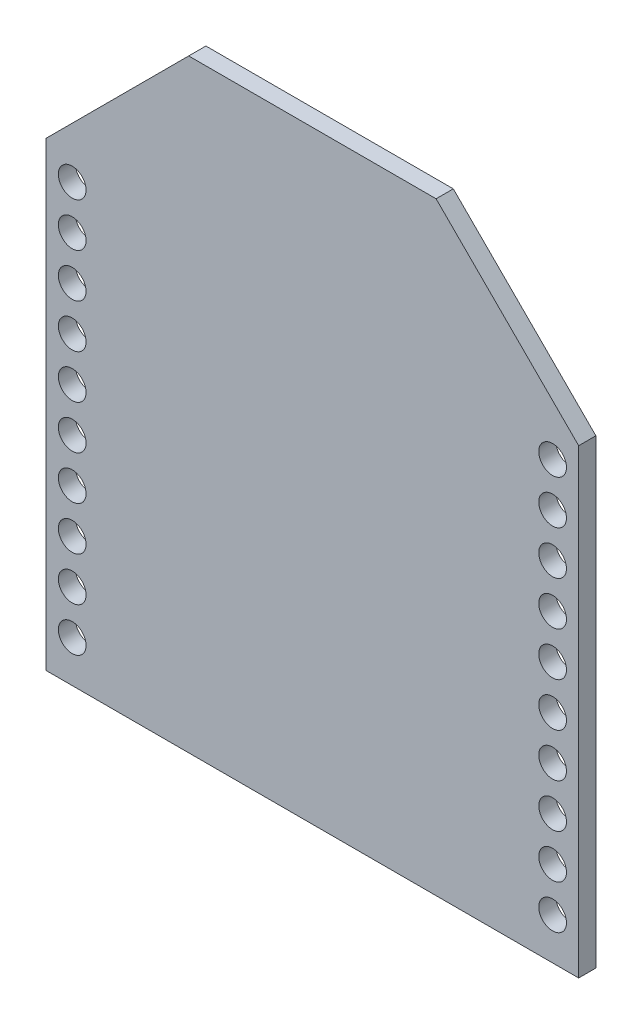
ISO-10303-21;
HEADER;
FILE_DESCRIPTION(('STEP AP214'),'2;1');
FILE_NAME('part.step','',(''),(''),'','','');
FILE_SCHEMA(('AUTOMOTIVE_DESIGN { 1 0 10303 214 1 1 1 1 }'));
ENDSEC;
DATA;
#1=APPLICATION_CONTEXT('core data for automotive mechanical design processes');
#2=APPLICATION_PROTOCOL_DEFINITION('international standard','automotive_design',2000,#1);
#3=PRODUCT_CONTEXT('',#1,'mechanical');
#4=PRODUCT('Part','Part','',(#3));
#5=PRODUCT_RELATED_PRODUCT_CATEGORY('part','',(#4));
#6=PRODUCT_DEFINITION_FORMATION('','',#4);
#7=PRODUCT_DEFINITION_CONTEXT('part definition',#1,'design');
#8=PRODUCT_DEFINITION('design','',#6,#7);
#9=PRODUCT_DEFINITION_SHAPE('','',#8);
#10=(LENGTH_UNIT() NAMED_UNIT(*) SI_UNIT(.MILLI.,.METRE.));
#11=(NAMED_UNIT(*) PLANE_ANGLE_UNIT() SI_UNIT($,.RADIAN.));
#12=(NAMED_UNIT(*) SI_UNIT($,.STERADIAN.) SOLID_ANGLE_UNIT());
#13=UNCERTAINTY_MEASURE_WITH_UNIT(LENGTH_MEASURE(1.E-05),#10,'distance_accuracy_value','');
#14=(GEOMETRIC_REPRESENTATION_CONTEXT(3) GLOBAL_UNCERTAINTY_ASSIGNED_CONTEXT((#13)) GLOBAL_UNIT_ASSIGNED_CONTEXT((#10,
#11,#12)) REPRESENTATION_CONTEXT('',''));
#15=CARTESIAN_POINT('',(0.,0.,0.));
#16=DIRECTION('',(0.,0.,1.));
#17=DIRECTION('',(1.,0.,0.));
#18=AXIS2_PLACEMENT_3D('',#15,#16,#17);
#19=CARTESIAN_POINT('',(0.,0.,0.7874));
#20=DIRECTION('',(0.,0.,1.));
#21=DIRECTION('',(1.,0.,0.));
#22=AXIS2_PLACEMENT_3D('',#19,#20,#21);
#23=PLANE('',#22);
#24=CARTESIAN_POINT('',(-10.9982000000001,4.14019999999999,0.7874));
#25=DIRECTION('',(0.,0.,1.));
#26=DIRECTION('',(1.,0.,0.));
#27=AXIS2_PLACEMENT_3D('',#24,#25,#26);
#28=CIRCLE('',#27,0.635000000000001);
#29=CARTESIAN_POINT('',(-10.3632000000001,4.14019999999999,0.7874));
#30=VERTEX_POINT('',#29);
#31=EDGE_CURVE('E257',#30,#30,#28,.T.);
#32=ORIENTED_EDGE('',*,*,#31,.F.);
#33=EDGE_LOOP('',(#32));
#34=FACE_BOUND('',#33,.T.);
#35=CARTESIAN_POINT('',(-10.9982,0.126999999999995,0.7874));
#36=DIRECTION('',(0.,0.,1.));
#37=DIRECTION('',(1.,0.,0.));
#38=AXIS2_PLACEMENT_3D('',#35,#36,#37);
#39=CIRCLE('',#38,0.635000000000001);
#40=CARTESIAN_POINT('',(-10.3632,0.126999999999995,0.7874));
#41=VERTEX_POINT('',#40);
#42=EDGE_CURVE('E269',#41,#41,#39,.T.);
#43=ORIENTED_EDGE('',*,*,#42,.F.);
#44=EDGE_LOOP('',(#43));
#45=FACE_BOUND('',#44,.T.);
#46=CARTESIAN_POINT('',(-10.9982,-3.8862,0.7874));
#47=DIRECTION('',(0.,0.,1.));
#48=DIRECTION('',(1.,0.,0.));
#49=AXIS2_PLACEMENT_3D('',#46,#47,#48);
#50=CIRCLE('',#49,0.635000000000001);
#51=CARTESIAN_POINT('',(-10.3632,-3.8862,0.7874));
#52=VERTEX_POINT('',#51);
#53=EDGE_CURVE('E281',#52,#52,#50,.T.);
#54=ORIENTED_EDGE('',*,*,#53,.F.);
#55=EDGE_LOOP('',(#54));
#56=FACE_BOUND('',#55,.T.);
#57=CARTESIAN_POINT('',(-10.9982,-7.8994,0.7874));
#58=DIRECTION('',(0.,0.,1.));
#59=DIRECTION('',(1.,0.,0.));
#60=AXIS2_PLACEMENT_3D('',#57,#58,#59);
#61=CIRCLE('',#60,0.635000000000001);
#62=CARTESIAN_POINT('',(-10.3632,-7.8994,0.7874));
#63=VERTEX_POINT('',#62);
#64=EDGE_CURVE('E293',#63,#63,#61,.T.);
#65=ORIENTED_EDGE('',*,*,#64,.F.);
#66=EDGE_LOOP('',(#65));
#67=FACE_BOUND('',#66,.T.);
#68=CARTESIAN_POINT('',(10.9981999999999,6.1468,0.7874));
#69=DIRECTION('',(0.,0.,1.));
#70=DIRECTION('',(1.,0.,0.));
#71=AXIS2_PLACEMENT_3D('',#68,#69,#70);
#72=CIRCLE('',#71,0.635000000000001);
#73=CARTESIAN_POINT('',(11.6331999999999,6.1468,0.7874));
#74=VERTEX_POINT('',#73);
#75=EDGE_CURVE('E305',#74,#74,#72,.T.);
#76=ORIENTED_EDGE('',*,*,#75,.F.);
#77=EDGE_LOOP('',(#76));
#78=FACE_BOUND('',#77,.T.);
#79=CARTESIAN_POINT('',(10.9982,2.13359999999999,0.7874));
#80=DIRECTION('',(0.,0.,1.));
#81=DIRECTION('',(1.,0.,0.));
#82=AXIS2_PLACEMENT_3D('',#79,#80,#81);
#83=CIRCLE('',#82,0.635000000000001);
#84=CARTESIAN_POINT('',(11.6332,2.13359999999999,0.7874));
#85=VERTEX_POINT('',#84);
#86=EDGE_CURVE('E317',#85,#85,#83,.T.);
#87=ORIENTED_EDGE('',*,*,#86,.F.);
#88=EDGE_LOOP('',(#87));
#89=FACE_BOUND('',#88,.T.);
#90=CARTESIAN_POINT('',(10.9982,-1.8796,0.7874));
#91=DIRECTION('',(0.,0.,1.));
#92=DIRECTION('',(1.,0.,0.));
#93=AXIS2_PLACEMENT_3D('',#90,#91,#92);
#94=CIRCLE('',#93,0.635000000000001);
#95=CARTESIAN_POINT('',(11.6332,-1.8796,0.7874));
#96=VERTEX_POINT('',#95);
#97=EDGE_CURVE('E329',#96,#96,#94,.T.);
#98=ORIENTED_EDGE('',*,*,#97,.F.);
#99=EDGE_LOOP('',(#98));
#100=FACE_BOUND('',#99,.T.);
#101=CARTESIAN_POINT('',(10.9982,-5.8928,0.7874));
#102=DIRECTION('',(0.,0.,1.));
#103=DIRECTION('',(1.,0.,0.));
#104=AXIS2_PLACEMENT_3D('',#101,#102,#103);
#105=CIRCLE('',#104,0.635000000000001);
#106=CARTESIAN_POINT('',(11.6332,-5.8928,0.7874));
#107=VERTEX_POINT('',#106);
#108=EDGE_CURVE('E341',#107,#107,#105,.T.);
#109=ORIENTED_EDGE('',*,*,#108,.F.);
#110=EDGE_LOOP('',(#109));
#111=FACE_BOUND('',#110,.T.);
#112=CARTESIAN_POINT('',(10.9982,-9.90600000000001,0.7874));
#113=DIRECTION('',(0.,0.,1.));
#114=DIRECTION('',(1.,0.,0.));
#115=AXIS2_PLACEMENT_3D('',#112,#113,#114);
#116=CIRCLE('',#115,0.635000000000001);
#117=CARTESIAN_POINT('',(11.6332,-9.90600000000001,0.7874));
#118=VERTEX_POINT('',#117);
#119=EDGE_CURVE('E353',#118,#118,#116,.T.);
#120=ORIENTED_EDGE('',*,*,#119,.F.);
#121=EDGE_LOOP('',(#120));
#122=FACE_BOUND('',#121,.T.);
#123=CARTESIAN_POINT('',(-10.9982,-11.9126,0.7874));
#124=DIRECTION('',(0.,0.,1.));
#125=DIRECTION('',(1.,0.,0.));
#126=AXIS2_PLACEMENT_3D('',#123,#124,#125);
#127=CIRCLE('',#126,0.635000000000001);
#128=CARTESIAN_POINT('',(-10.3632,-11.9126,0.7874));
#129=VERTEX_POINT('',#128);
#130=EDGE_CURVE('E126',#129,#129,#127,.T.);
#131=ORIENTED_EDGE('',*,*,#130,.F.);
#132=EDGE_LOOP('',(#131));
#133=FACE_BOUND('',#132,.T.);
#134=DIRECTION('',(0.,1.,0.));
#135=VECTOR('',#134,1.);
#136=CARTESIAN_POINT('',(12.192,-13.8176,0.7874));
#137=LINE('',#136,#135);
#138=CARTESIAN_POINT('',(12.192,-13.8176,0.7874));
#139=VERTEX_POINT('',#138);
#140=CARTESIAN_POINT('',(12.192,7.2898,0.7874));
#141=VERTEX_POINT('',#140);
#142=EDGE_CURVE('E133',#139,#141,#137,.T.);
#143=ORIENTED_EDGE('',*,*,#142,.T.);
#144=DIRECTION('',(-0.707106781186548,0.707106781186547,0.));
#145=VECTOR('',#144,1.);
#146=CARTESIAN_POINT('',(12.192,7.2898,0.7874));
#147=LINE('',#146,#145);
#148=CARTESIAN_POINT('',(5.6642,13.8176,0.7874));
#149=VERTEX_POINT('',#148);
#150=EDGE_CURVE('E91',#141,#149,#147,.T.);
#151=ORIENTED_EDGE('',*,*,#150,.T.);
#152=DIRECTION('',(-1.,0.,0.));
#153=VECTOR('',#152,1.);
#154=CARTESIAN_POINT('',(5.6642,13.8176,0.7874));
#155=LINE('',#154,#153);
#156=CARTESIAN_POINT('',(-5.6642,13.8176,0.7874));
#157=VERTEX_POINT('',#156);
#158=EDGE_CURVE('E104',#149,#157,#155,.T.);
#159=ORIENTED_EDGE('',*,*,#158,.T.);
#160=DIRECTION('',(-0.707106781186547,-0.707106781186548,0.));
#161=VECTOR('',#160,1.);
#162=CARTESIAN_POINT('',(-5.6642,13.8176,0.7874));
#163=LINE('',#162,#161);
#164=CARTESIAN_POINT('',(-12.192,7.28979999999999,0.7874));
#165=VERTEX_POINT('',#164);
#166=EDGE_CURVE('E98',#157,#165,#163,.T.);
#167=ORIENTED_EDGE('',*,*,#166,.T.);
#168=DIRECTION('',(0.,-1.,0.));
#169=VECTOR('',#168,1.);
#170=CARTESIAN_POINT('',(-12.192,-13.8176,0.7874));
#171=LINE('',#170,#169);
#172=CARTESIAN_POINT('',(-12.192,-13.8176,0.7874));
#173=VERTEX_POINT('',#172);
#174=EDGE_CURVE('E102',#165,#173,#171,.T.);
#175=ORIENTED_EDGE('',*,*,#174,.T.);
#176=DIRECTION('',(1.,0.,0.));
#177=VECTOR('',#176,1.);
#178=CARTESIAN_POINT('',(12.192,-13.8176,0.7874));
#179=LINE('',#178,#177);
#180=EDGE_CURVE('E54',#173,#139,#179,.T.);
#181=ORIENTED_EDGE('',*,*,#180,.T.);
#182=EDGE_LOOP('',(#143,#151,#159,#167,#175,#181));
#183=FACE_BOUND('',#182,.T.);
#184=CARTESIAN_POINT('',(10.9982,-11.9126,0.7874));
#185=DIRECTION('',(0.,0.,1.));
#186=DIRECTION('',(1.,0.,0.));
#187=AXIS2_PLACEMENT_3D('',#184,#185,#186);
#188=CIRCLE('',#187,0.635000000000001);
#189=CARTESIAN_POINT('',(11.6332,-11.9126,0.7874));
#190=VERTEX_POINT('',#189);
#191=EDGE_CURVE('E359',#190,#190,#188,.T.);
#192=ORIENTED_EDGE('',*,*,#191,.F.);
#193=EDGE_LOOP('',(#192));
#194=FACE_BOUND('',#193,.T.);
#195=CARTESIAN_POINT('',(10.9982,-7.8994,0.7874));
#196=DIRECTION('',(0.,0.,1.));
#197=DIRECTION('',(1.,0.,0.));
#198=AXIS2_PLACEMENT_3D('',#195,#196,#197);
#199=CIRCLE('',#198,0.635000000000001);
#200=CARTESIAN_POINT('',(11.6332,-7.8994,0.7874));
#201=VERTEX_POINT('',#200);
#202=EDGE_CURVE('E347',#201,#201,#199,.T.);
#203=ORIENTED_EDGE('',*,*,#202,.F.);
#204=EDGE_LOOP('',(#203));
#205=FACE_BOUND('',#204,.T.);
#206=CARTESIAN_POINT('',(10.9982,-3.8862,0.7874));
#207=DIRECTION('',(0.,0.,1.));
#208=DIRECTION('',(1.,0.,0.));
#209=AXIS2_PLACEMENT_3D('',#206,#207,#208);
#210=CIRCLE('',#209,0.635000000000001);
#211=CARTESIAN_POINT('',(11.6332,-3.8862,0.7874));
#212=VERTEX_POINT('',#211);
#213=EDGE_CURVE('E335',#212,#212,#210,.T.);
#214=ORIENTED_EDGE('',*,*,#213,.F.);
#215=EDGE_LOOP('',(#214));
#216=FACE_BOUND('',#215,.T.);
#217=CARTESIAN_POINT('',(10.9982,0.126999999999995,0.7874));
#218=DIRECTION('',(0.,0.,1.));
#219=DIRECTION('',(1.,0.,0.));
#220=AXIS2_PLACEMENT_3D('',#217,#218,#219);
#221=CIRCLE('',#220,0.635000000000001);
#222=CARTESIAN_POINT('',(11.6332,0.126999999999995,0.7874));
#223=VERTEX_POINT('',#222);
#224=EDGE_CURVE('E323',#223,#223,#221,.T.);
#225=ORIENTED_EDGE('',*,*,#224,.F.);
#226=EDGE_LOOP('',(#225));
#227=FACE_BOUND('',#226,.T.);
#228=CARTESIAN_POINT('',(10.9981999999999,4.14019999999999,0.7874));
#229=DIRECTION('',(0.,0.,1.));
#230=DIRECTION('',(1.,0.,0.));
#231=AXIS2_PLACEMENT_3D('',#228,#229,#230);
#232=CIRCLE('',#231,0.635000000000001);
#233=CARTESIAN_POINT('',(11.6331999999999,4.14019999999999,0.7874));
#234=VERTEX_POINT('',#233);
#235=EDGE_CURVE('E311',#234,#234,#232,.T.);
#236=ORIENTED_EDGE('',*,*,#235,.F.);
#237=EDGE_LOOP('',(#236));
#238=FACE_BOUND('',#237,.T.);
#239=CARTESIAN_POINT('',(-10.9982,-9.90600000000001,0.7874));
#240=DIRECTION('',(0.,0.,1.));
#241=DIRECTION('',(1.,0.,0.));
#242=AXIS2_PLACEMENT_3D('',#239,#240,#241);
#243=CIRCLE('',#242,0.635000000000001);
#244=CARTESIAN_POINT('',(-10.3632,-9.90600000000001,0.7874));
#245=VERTEX_POINT('',#244);
#246=EDGE_CURVE('E299',#245,#245,#243,.T.);
#247=ORIENTED_EDGE('',*,*,#246,.F.);
#248=EDGE_LOOP('',(#247));
#249=FACE_BOUND('',#248,.T.);
#250=CARTESIAN_POINT('',(-10.9982,-5.8928,0.7874));
#251=DIRECTION('',(0.,0.,1.));
#252=DIRECTION('',(1.,0.,0.));
#253=AXIS2_PLACEMENT_3D('',#250,#251,#252);
#254=CIRCLE('',#253,0.635000000000001);
#255=CARTESIAN_POINT('',(-10.3632,-5.8928,0.7874));
#256=VERTEX_POINT('',#255);
#257=EDGE_CURVE('E287',#256,#256,#254,.T.);
#258=ORIENTED_EDGE('',*,*,#257,.F.);
#259=EDGE_LOOP('',(#258));
#260=FACE_BOUND('',#259,.T.);
#261=CARTESIAN_POINT('',(-10.9982,-1.8796,0.7874));
#262=DIRECTION('',(0.,0.,1.));
#263=DIRECTION('',(1.,0.,0.));
#264=AXIS2_PLACEMENT_3D('',#261,#262,#263);
#265=CIRCLE('',#264,0.635000000000001);
#266=CARTESIAN_POINT('',(-10.3632,-1.8796,0.7874));
#267=VERTEX_POINT('',#266);
#268=EDGE_CURVE('E275',#267,#267,#265,.T.);
#269=ORIENTED_EDGE('',*,*,#268,.F.);
#270=EDGE_LOOP('',(#269));
#271=FACE_BOUND('',#270,.T.);
#272=CARTESIAN_POINT('',(-10.9982,2.13359999999999,0.7874));
#273=DIRECTION('',(0.,0.,1.));
#274=DIRECTION('',(1.,0.,0.));
#275=AXIS2_PLACEMENT_3D('',#272,#273,#274);
#276=CIRCLE('',#275,0.635000000000001);
#277=CARTESIAN_POINT('',(-10.3632,2.13359999999999,0.7874));
#278=VERTEX_POINT('',#277);
#279=EDGE_CURVE('E263',#278,#278,#276,.T.);
#280=ORIENTED_EDGE('',*,*,#279,.F.);
#281=EDGE_LOOP('',(#280));
#282=FACE_BOUND('',#281,.T.);
#283=CARTESIAN_POINT('',(-10.9982000000001,6.1468,0.7874));
#284=DIRECTION('',(0.,0.,1.));
#285=DIRECTION('',(1.,0.,0.));
#286=AXIS2_PLACEMENT_3D('',#283,#284,#285);
#287=CIRCLE('',#286,0.635000000000001);
#288=CARTESIAN_POINT('',(-10.3632000000001,6.1468,0.7874));
#289=VERTEX_POINT('',#288);
#290=EDGE_CURVE('E248',#289,#289,#287,.T.);
#291=ORIENTED_EDGE('',*,*,#290,.F.);
#292=EDGE_LOOP('',(#291));
#293=FACE_BOUND('',#292,.T.);
#294=ADVANCED_FACE('F37',(#34,#45,#56,#67,#78,#89,#100,#111,#122,#133,#183,#194,#205,#216,#227,
#238,#249,#260,#271,#282,#293),#23,.T.);
#295=CARTESIAN_POINT('',(0.,0.,0.));
#296=DIRECTION('',(0.,0.,1.));
#297=DIRECTION('',(1.,0.,0.));
#298=AXIS2_PLACEMENT_3D('',#295,#296,#297);
#299=PLANE('',#298);
#300=DIRECTION('',(0.,1.,0.));
#301=VECTOR('',#300,1.);
#302=CARTESIAN_POINT('',(12.192,-13.8176,0.));
#303=LINE('',#302,#301);
#304=CARTESIAN_POINT('',(12.192,-13.8176,0.));
#305=VERTEX_POINT('',#304);
#306=CARTESIAN_POINT('',(12.192,7.2898,0.));
#307=VERTEX_POINT('',#306);
#308=EDGE_CURVE('E122',#305,#307,#303,.T.);
#309=ORIENTED_EDGE('',*,*,#308,.F.);
#310=DIRECTION('',(1.,0.,0.));
#311=VECTOR('',#310,1.);
#312=CARTESIAN_POINT('',(12.192,-13.8176,0.));
#313=LINE('',#312,#311);
#314=CARTESIAN_POINT('',(-12.192,-13.8176,0.));
#315=VERTEX_POINT('',#314);
#316=EDGE_CURVE('E83',#315,#305,#313,.T.);
#317=ORIENTED_EDGE('',*,*,#316,.F.);
#318=DIRECTION('',(0.,-1.,0.));
#319=VECTOR('',#318,1.);
#320=CARTESIAN_POINT('',(-12.192,-13.8176,0.));
#321=LINE('',#320,#319);
#322=CARTESIAN_POINT('',(-12.192,7.28979999999999,0.));
#323=VERTEX_POINT('',#322);
#324=EDGE_CURVE('E77',#323,#315,#321,.T.);
#325=ORIENTED_EDGE('',*,*,#324,.F.);
#326=DIRECTION('',(-0.707106781186547,-0.707106781186548,0.));
#327=VECTOR('',#326,1.);
#328=CARTESIAN_POINT('',(-5.6642,13.8176,0.));
#329=LINE('',#328,#327);
#330=CARTESIAN_POINT('',(-5.6642,13.8176,0.));
#331=VERTEX_POINT('',#330);
#332=EDGE_CURVE('E112',#331,#323,#329,.T.);
#333=ORIENTED_EDGE('',*,*,#332,.F.);
#334=DIRECTION('',(-1.,0.,0.));
#335=VECTOR('',#334,1.);
#336=CARTESIAN_POINT('',(5.6642,13.8176,0.));
#337=LINE('',#336,#335);
#338=CARTESIAN_POINT('',(5.6642,13.8176,0.));
#339=VERTEX_POINT('',#338);
#340=EDGE_CURVE('E128',#339,#331,#337,.T.);
#341=ORIENTED_EDGE('',*,*,#340,.F.);
#342=DIRECTION('',(-0.707106781186548,0.707106781186547,0.));
#343=VECTOR('',#342,1.);
#344=CARTESIAN_POINT('',(12.192,7.2898,0.));
#345=LINE('',#344,#343);
#346=EDGE_CURVE('E125',#307,#339,#345,.T.);
#347=ORIENTED_EDGE('',*,*,#346,.F.);
#348=EDGE_LOOP('',(#309,#317,#325,#333,#341,#347));
#349=FACE_BOUND('',#348,.T.);
#350=CARTESIAN_POINT('',(-10.9982,-11.9126,0.));
#351=DIRECTION('',(0.,0.,1.));
#352=DIRECTION('',(1.,0.,0.));
#353=AXIS2_PLACEMENT_3D('',#350,#351,#352);
#354=CIRCLE('',#353,0.635000000000001);
#355=CARTESIAN_POINT('',(-10.3632,-11.9126,0.));
#356=VERTEX_POINT('',#355);
#357=EDGE_CURVE('E362',#356,#356,#354,.T.);
#358=ORIENTED_EDGE('',*,*,#357,.T.);
#359=EDGE_LOOP('',(#358));
#360=FACE_BOUND('',#359,.T.);
#361=CARTESIAN_POINT('',(10.9982,-11.9126,0.));
#362=DIRECTION('',(0.,0.,1.));
#363=DIRECTION('',(1.,0.,0.));
#364=AXIS2_PLACEMENT_3D('',#361,#362,#363);
#365=CIRCLE('',#364,0.635000000000001);
#366=CARTESIAN_POINT('',(11.6332,-11.9126,0.));
#367=VERTEX_POINT('',#366);
#368=EDGE_CURVE('E356',#367,#367,#365,.T.);
#369=ORIENTED_EDGE('',*,*,#368,.T.);
#370=EDGE_LOOP('',(#369));
#371=FACE_BOUND('',#370,.T.);
#372=CARTESIAN_POINT('',(10.9982,-9.90600000000001,0.));
#373=DIRECTION('',(0.,0.,1.));
#374=DIRECTION('',(1.,0.,0.));
#375=AXIS2_PLACEMENT_3D('',#372,#373,#374);
#376=CIRCLE('',#375,0.635000000000001);
#377=CARTESIAN_POINT('',(11.6332,-9.90600000000001,0.));
#378=VERTEX_POINT('',#377);
#379=EDGE_CURVE('E350',#378,#378,#376,.T.);
#380=ORIENTED_EDGE('',*,*,#379,.T.);
#381=EDGE_LOOP('',(#380));
#382=FACE_BOUND('',#381,.T.);
#383=CARTESIAN_POINT('',(10.9982,-7.8994,0.));
#384=DIRECTION('',(0.,0.,1.));
#385=DIRECTION('',(1.,0.,0.));
#386=AXIS2_PLACEMENT_3D('',#383,#384,#385);
#387=CIRCLE('',#386,0.635000000000001);
#388=CARTESIAN_POINT('',(11.6332,-7.8994,0.));
#389=VERTEX_POINT('',#388);
#390=EDGE_CURVE('E344',#389,#389,#387,.T.);
#391=ORIENTED_EDGE('',*,*,#390,.T.);
#392=EDGE_LOOP('',(#391));
#393=FACE_BOUND('',#392,.T.);
#394=CARTESIAN_POINT('',(10.9982,-5.8928,0.));
#395=DIRECTION('',(0.,0.,1.));
#396=DIRECTION('',(1.,0.,0.));
#397=AXIS2_PLACEMENT_3D('',#394,#395,#396);
#398=CIRCLE('',#397,0.635000000000001);
#399=CARTESIAN_POINT('',(11.6332,-5.8928,0.));
#400=VERTEX_POINT('',#399);
#401=EDGE_CURVE('E338',#400,#400,#398,.T.);
#402=ORIENTED_EDGE('',*,*,#401,.T.);
#403=EDGE_LOOP('',(#402));
#404=FACE_BOUND('',#403,.T.);
#405=CARTESIAN_POINT('',(10.9982,-3.8862,0.));
#406=DIRECTION('',(0.,0.,1.));
#407=DIRECTION('',(1.,0.,0.));
#408=AXIS2_PLACEMENT_3D('',#405,#406,#407);
#409=CIRCLE('',#408,0.635000000000001);
#410=CARTESIAN_POINT('',(11.6332,-3.8862,0.));
#411=VERTEX_POINT('',#410);
#412=EDGE_CURVE('E332',#411,#411,#409,.T.);
#413=ORIENTED_EDGE('',*,*,#412,.T.);
#414=EDGE_LOOP('',(#413));
#415=FACE_BOUND('',#414,.T.);
#416=CARTESIAN_POINT('',(10.9982,-1.8796,0.));
#417=DIRECTION('',(0.,0.,1.));
#418=DIRECTION('',(1.,0.,0.));
#419=AXIS2_PLACEMENT_3D('',#416,#417,#418);
#420=CIRCLE('',#419,0.635000000000001);
#421=CARTESIAN_POINT('',(11.6332,-1.8796,0.));
#422=VERTEX_POINT('',#421);
#423=EDGE_CURVE('E326',#422,#422,#420,.T.);
#424=ORIENTED_EDGE('',*,*,#423,.T.);
#425=EDGE_LOOP('',(#424));
#426=FACE_BOUND('',#425,.T.);
#427=CARTESIAN_POINT('',(10.9982,0.126999999999995,0.));
#428=DIRECTION('',(0.,0.,1.));
#429=DIRECTION('',(1.,0.,0.));
#430=AXIS2_PLACEMENT_3D('',#427,#428,#429);
#431=CIRCLE('',#430,0.635000000000001);
#432=CARTESIAN_POINT('',(11.6332,0.126999999999995,0.));
#433=VERTEX_POINT('',#432);
#434=EDGE_CURVE('E320',#433,#433,#431,.T.);
#435=ORIENTED_EDGE('',*,*,#434,.T.);
#436=EDGE_LOOP('',(#435));
#437=FACE_BOUND('',#436,.T.);
#438=CARTESIAN_POINT('',(10.9982,2.13359999999999,0.));
#439=DIRECTION('',(0.,0.,1.));
#440=DIRECTION('',(1.,0.,0.));
#441=AXIS2_PLACEMENT_3D('',#438,#439,#440);
#442=CIRCLE('',#441,0.635000000000001);
#443=CARTESIAN_POINT('',(11.6332,2.13359999999999,0.));
#444=VERTEX_POINT('',#443);
#445=EDGE_CURVE('E314',#444,#444,#442,.T.);
#446=ORIENTED_EDGE('',*,*,#445,.T.);
#447=EDGE_LOOP('',(#446));
#448=FACE_BOUND('',#447,.T.);
#449=CARTESIAN_POINT('',(10.9981999999999,4.14019999999999,0.));
#450=DIRECTION('',(0.,0.,1.));
#451=DIRECTION('',(1.,0.,0.));
#452=AXIS2_PLACEMENT_3D('',#449,#450,#451);
#453=CIRCLE('',#452,0.635000000000001);
#454=CARTESIAN_POINT('',(11.6331999999999,4.14019999999999,0.));
#455=VERTEX_POINT('',#454);
#456=EDGE_CURVE('E308',#455,#455,#453,.T.);
#457=ORIENTED_EDGE('',*,*,#456,.T.);
#458=EDGE_LOOP('',(#457));
#459=FACE_BOUND('',#458,.T.);
#460=CARTESIAN_POINT('',(10.9981999999999,6.1468,0.));
#461=DIRECTION('',(0.,0.,1.));
#462=DIRECTION('',(1.,0.,0.));
#463=AXIS2_PLACEMENT_3D('',#460,#461,#462);
#464=CIRCLE('',#463,0.635000000000001);
#465=CARTESIAN_POINT('',(11.6331999999999,6.1468,0.));
#466=VERTEX_POINT('',#465);
#467=EDGE_CURVE('E302',#466,#466,#464,.T.);
#468=ORIENTED_EDGE('',*,*,#467,.T.);
#469=EDGE_LOOP('',(#468));
#470=FACE_BOUND('',#469,.T.);
#471=CARTESIAN_POINT('',(-10.9982,-9.90600000000001,0.));
#472=DIRECTION('',(0.,0.,1.));
#473=DIRECTION('',(1.,0.,0.));
#474=AXIS2_PLACEMENT_3D('',#471,#472,#473);
#475=CIRCLE('',#474,0.635000000000001);
#476=CARTESIAN_POINT('',(-10.3632,-9.90600000000001,0.));
#477=VERTEX_POINT('',#476);
#478=EDGE_CURVE('E296',#477,#477,#475,.T.);
#479=ORIENTED_EDGE('',*,*,#478,.T.);
#480=EDGE_LOOP('',(#479));
#481=FACE_BOUND('',#480,.T.);
#482=CARTESIAN_POINT('',(-10.9982,-7.8994,0.));
#483=DIRECTION('',(0.,0.,1.));
#484=DIRECTION('',(1.,0.,0.));
#485=AXIS2_PLACEMENT_3D('',#482,#483,#484);
#486=CIRCLE('',#485,0.635000000000001);
#487=CARTESIAN_POINT('',(-10.3632,-7.8994,0.));
#488=VERTEX_POINT('',#487);
#489=EDGE_CURVE('E290',#488,#488,#486,.T.);
#490=ORIENTED_EDGE('',*,*,#489,.T.);
#491=EDGE_LOOP('',(#490));
#492=FACE_BOUND('',#491,.T.);
#493=CARTESIAN_POINT('',(-10.9982,-5.8928,0.));
#494=DIRECTION('',(0.,0.,1.));
#495=DIRECTION('',(1.,0.,0.));
#496=AXIS2_PLACEMENT_3D('',#493,#494,#495);
#497=CIRCLE('',#496,0.635000000000001);
#498=CARTESIAN_POINT('',(-10.3632,-5.8928,0.));
#499=VERTEX_POINT('',#498);
#500=EDGE_CURVE('E284',#499,#499,#497,.T.);
#501=ORIENTED_EDGE('',*,*,#500,.T.);
#502=EDGE_LOOP('',(#501));
#503=FACE_BOUND('',#502,.T.);
#504=CARTESIAN_POINT('',(-10.9982,-3.8862,0.));
#505=DIRECTION('',(0.,0.,1.));
#506=DIRECTION('',(1.,0.,0.));
#507=AXIS2_PLACEMENT_3D('',#504,#505,#506);
#508=CIRCLE('',#507,0.635000000000001);
#509=CARTESIAN_POINT('',(-10.3632,-3.8862,0.));
#510=VERTEX_POINT('',#509);
#511=EDGE_CURVE('E278',#510,#510,#508,.T.);
#512=ORIENTED_EDGE('',*,*,#511,.T.);
#513=EDGE_LOOP('',(#512));
#514=FACE_BOUND('',#513,.T.);
#515=CARTESIAN_POINT('',(-10.9982,-1.8796,0.));
#516=DIRECTION('',(0.,0.,1.));
#517=DIRECTION('',(1.,0.,0.));
#518=AXIS2_PLACEMENT_3D('',#515,#516,#517);
#519=CIRCLE('',#518,0.635000000000001);
#520=CARTESIAN_POINT('',(-10.3632,-1.8796,0.));
#521=VERTEX_POINT('',#520);
#522=EDGE_CURVE('E272',#521,#521,#519,.T.);
#523=ORIENTED_EDGE('',*,*,#522,.T.);
#524=EDGE_LOOP('',(#523));
#525=FACE_BOUND('',#524,.T.);
#526=CARTESIAN_POINT('',(-10.9982,0.126999999999995,0.));
#527=DIRECTION('',(0.,0.,1.));
#528=DIRECTION('',(1.,0.,0.));
#529=AXIS2_PLACEMENT_3D('',#526,#527,#528);
#530=CIRCLE('',#529,0.635000000000001);
#531=CARTESIAN_POINT('',(-10.3632,0.126999999999995,0.));
#532=VERTEX_POINT('',#531);
#533=EDGE_CURVE('E266',#532,#532,#530,.T.);
#534=ORIENTED_EDGE('',*,*,#533,.T.);
#535=EDGE_LOOP('',(#534));
#536=FACE_BOUND('',#535,.T.);
#537=CARTESIAN_POINT('',(-10.9982,2.13359999999999,0.));
#538=DIRECTION('',(0.,0.,1.));
#539=DIRECTION('',(1.,0.,0.));
#540=AXIS2_PLACEMENT_3D('',#537,#538,#539);
#541=CIRCLE('',#540,0.635000000000001);
#542=CARTESIAN_POINT('',(-10.3632,2.13359999999999,0.));
#543=VERTEX_POINT('',#542);
#544=EDGE_CURVE('E260',#543,#543,#541,.T.);
#545=ORIENTED_EDGE('',*,*,#544,.T.);
#546=EDGE_LOOP('',(#545));
#547=FACE_BOUND('',#546,.T.);
#548=CARTESIAN_POINT('',(-10.9982000000001,4.14019999999999,0.));
#549=DIRECTION('',(0.,0.,1.));
#550=DIRECTION('',(1.,0.,0.));
#551=AXIS2_PLACEMENT_3D('',#548,#549,#550);
#552=CIRCLE('',#551,0.635000000000001);
#553=CARTESIAN_POINT('',(-10.3632000000001,4.14019999999999,0.));
#554=VERTEX_POINT('',#553);
#555=EDGE_CURVE('E254',#554,#554,#552,.T.);
#556=ORIENTED_EDGE('',*,*,#555,.T.);
#557=EDGE_LOOP('',(#556));
#558=FACE_BOUND('',#557,.T.);
#559=CARTESIAN_POINT('',(-10.9982000000001,6.1468,0.));
#560=DIRECTION('',(0.,0.,1.));
#561=DIRECTION('',(1.,0.,0.));
#562=AXIS2_PLACEMENT_3D('',#559,#560,#561);
#563=CIRCLE('',#562,0.635000000000001);
#564=CARTESIAN_POINT('',(-10.3632000000001,6.1468,0.));
#565=VERTEX_POINT('',#564);
#566=EDGE_CURVE('E251',#565,#565,#563,.T.);
#567=ORIENTED_EDGE('',*,*,#566,.T.);
#568=EDGE_LOOP('',(#567));
#569=FACE_BOUND('',#568,.T.);
#570=ADVANCED_FACE('F142',(#349,#360,#371,#382,#393,#404,#415,#426,#437,#448,#459,#470,#481,
#492,#503,#514,#525,#536,#547,#558,#569),#299,.F.);
#571=CARTESIAN_POINT('',(12.192,-13.8176,0.7874));
#572=DIRECTION('',(-1.,0.,0.));
#573=DIRECTION('',(0.,0.,1.));
#574=AXIS2_PLACEMENT_3D('',#571,#572,#573);
#575=PLANE('',#574);
#576=ORIENTED_EDGE('',*,*,#308,.T.);
#577=DIRECTION('',(0.,0.,-1.));
#578=VECTOR('',#577,1.);
#579=CARTESIAN_POINT('',(12.192,7.2898,0.7874));
#580=LINE('',#579,#578);
#581=EDGE_CURVE('E11',#141,#307,#580,.T.);
#582=ORIENTED_EDGE('',*,*,#581,.F.);
#583=ORIENTED_EDGE('',*,*,#142,.F.);
#584=DIRECTION('',(0.,0.,-1.));
#585=VECTOR('',#584,1.);
#586=CARTESIAN_POINT('',(12.192,-13.8176,0.7874));
#587=LINE('',#586,#585);
#588=EDGE_CURVE('E118',#139,#305,#587,.T.);
#589=ORIENTED_EDGE('',*,*,#588,.T.);
#590=EDGE_LOOP('',(#576,#582,#583,#589));
#591=FACE_BOUND('',#590,.T.);
#592=ADVANCED_FACE('F39',(#591),#575,.F.);
#593=CARTESIAN_POINT('',(12.192,7.2898,0.7874));
#594=DIRECTION('',(-0.707106781186547,-0.707106781186548,0.));
#595=DIRECTION('',(0.707106781186548,-0.707106781186547,0.));
#596=AXIS2_PLACEMENT_3D('',#593,#594,#595);
#597=PLANE('',#596);
#598=ORIENTED_EDGE('',*,*,#346,.T.);
#599=DIRECTION('',(0.,0.,-1.));
#600=VECTOR('',#599,1.);
#601=CARTESIAN_POINT('',(5.6642,13.8176,0.7874));
#602=LINE('',#601,#600);
#603=EDGE_CURVE('E46',#149,#339,#602,.T.);
#604=ORIENTED_EDGE('',*,*,#603,.F.);
#605=ORIENTED_EDGE('',*,*,#150,.F.);
#606=ORIENTED_EDGE('',*,*,#581,.T.);
#607=EDGE_LOOP('',(#598,#604,#605,#606));
#608=FACE_BOUND('',#607,.T.);
#609=ADVANCED_FACE('F564',(#608),#597,.F.);
#610=CARTESIAN_POINT('',(5.6642,13.8176,0.7874));
#611=DIRECTION('',(0.,-1.,0.));
#612=DIRECTION('',(0.,0.,-1.));
#613=AXIS2_PLACEMENT_3D('',#610,#611,#612);
#614=PLANE('',#613);
#615=ORIENTED_EDGE('',*,*,#340,.T.);
#616=DIRECTION('',(0.,0.,-1.));
#617=VECTOR('',#616,1.);
#618=CARTESIAN_POINT('',(-5.6642,13.8176,0.7874));
#619=LINE('',#618,#617);
#620=EDGE_CURVE('E113',#157,#331,#619,.T.);
#621=ORIENTED_EDGE('',*,*,#620,.F.);
#622=ORIENTED_EDGE('',*,*,#158,.F.);
#623=ORIENTED_EDGE('',*,*,#603,.T.);
#624=EDGE_LOOP('',(#615,#621,#622,#623));
#625=FACE_BOUND('',#624,.T.);
#626=ADVANCED_FACE('F139',(#625),#614,.F.);
#627=CARTESIAN_POINT('',(-5.6642,13.8176,0.7874));
#628=DIRECTION('',(0.707106781186548,-0.707106781186547,0.));
#629=DIRECTION('',(0.707106781186547,0.707106781186548,0.));
#630=AXIS2_PLACEMENT_3D('',#627,#628,#629);
#631=PLANE('',#630);
#632=ORIENTED_EDGE('',*,*,#332,.T.);
#633=DIRECTION('',(0.,0.,-1.));
#634=VECTOR('',#633,1.);
#635=CARTESIAN_POINT('',(-12.192,7.28979999999999,0.7874));
#636=LINE('',#635,#634);
#637=EDGE_CURVE('E109',#165,#323,#636,.T.);
#638=ORIENTED_EDGE('',*,*,#637,.F.);
#639=ORIENTED_EDGE('',*,*,#166,.F.);
#640=ORIENTED_EDGE('',*,*,#620,.T.);
#641=EDGE_LOOP('',(#632,#638,#639,#640));
#642=FACE_BOUND('',#641,.T.);
#643=ADVANCED_FACE('F110',(#642),#631,.F.);
#644=CARTESIAN_POINT('',(-12.192,-13.8176,0.7874));
#645=DIRECTION('',(1.,0.,0.));
#646=DIRECTION('',(0.,0.,-1.));
#647=AXIS2_PLACEMENT_3D('',#644,#645,#646);
#648=PLANE('',#647);
#649=ORIENTED_EDGE('',*,*,#324,.T.);
#650=DIRECTION('',(0.,0.,-1.));
#651=VECTOR('',#650,1.);
#652=CARTESIAN_POINT('',(-12.192,-13.8176,0.7874));
#653=LINE('',#652,#651);
#654=EDGE_CURVE('E114',#173,#315,#653,.T.);
#655=ORIENTED_EDGE('',*,*,#654,.F.);
#656=ORIENTED_EDGE('',*,*,#174,.F.);
#657=ORIENTED_EDGE('',*,*,#637,.T.);
#658=EDGE_LOOP('',(#649,#655,#656,#657));
#659=FACE_BOUND('',#658,.T.);
#660=ADVANCED_FACE('F116',(#659),#648,.F.);
#661=CARTESIAN_POINT('',(12.192,-13.8176,0.7874));
#662=DIRECTION('',(0.,1.,0.));
#663=DIRECTION('',(-1.,0.,0.));
#664=AXIS2_PLACEMENT_3D('',#661,#662,#663);
#665=PLANE('',#664);
#666=ORIENTED_EDGE('',*,*,#316,.T.);
#667=ORIENTED_EDGE('',*,*,#588,.F.);
#668=ORIENTED_EDGE('',*,*,#180,.F.);
#669=ORIENTED_EDGE('',*,*,#654,.T.);
#670=EDGE_LOOP('',(#666,#667,#668,#669));
#671=FACE_BOUND('',#670,.T.);
#672=ADVANCED_FACE('F147',(#671),#665,.F.);
#673=CARTESIAN_POINT('',(-10.9982,-11.9126,0.7874));
#674=DIRECTION('',(0.,0.,-1.));
#675=DIRECTION('',(-1.,0.,0.));
#676=AXIS2_PLACEMENT_3D('',#673,#674,#675);
#677=CYLINDRICAL_SURFACE('',#676,0.635000000000001);
#678=ORIENTED_EDGE('',*,*,#130,.T.);
#679=EDGE_LOOP('',(#678));
#680=FACE_BOUND('',#679,.T.);
#681=ORIENTED_EDGE('',*,*,#357,.F.);
#682=EDGE_LOOP('',(#681));
#683=FACE_BOUND('',#682,.T.);
#684=ADVANCED_FACE('F149',(#680,#683),#677,.F.);
#685=CARTESIAN_POINT('',(10.9982,-11.9126,0.7874));
#686=DIRECTION('',(0.,0.,-1.));
#687=DIRECTION('',(-1.,0.,0.));
#688=AXIS2_PLACEMENT_3D('',#685,#686,#687);
#689=CYLINDRICAL_SURFACE('',#688,0.635000000000001);
#690=ORIENTED_EDGE('',*,*,#191,.T.);
#691=EDGE_LOOP('',(#690));
#692=FACE_BOUND('',#691,.T.);
#693=ORIENTED_EDGE('',*,*,#368,.F.);
#694=EDGE_LOOP('',(#693));
#695=FACE_BOUND('',#694,.T.);
#696=ADVANCED_FACE('F155',(#692,#695),#689,.F.);
#697=CARTESIAN_POINT('',(10.9982,-9.90600000000001,0.7874));
#698=DIRECTION('',(0.,0.,-1.));
#699=DIRECTION('',(-1.,0.,0.));
#700=AXIS2_PLACEMENT_3D('',#697,#698,#699);
#701=CYLINDRICAL_SURFACE('',#700,0.635000000000001);
#702=ORIENTED_EDGE('',*,*,#119,.T.);
#703=EDGE_LOOP('',(#702));
#704=FACE_BOUND('',#703,.T.);
#705=ORIENTED_EDGE('',*,*,#379,.F.);
#706=EDGE_LOOP('',(#705));
#707=FACE_BOUND('',#706,.T.);
#708=ADVANCED_FACE('F171',(#704,#707),#701,.F.);
#709=CARTESIAN_POINT('',(10.9982,-7.8994,0.7874));
#710=DIRECTION('',(0.,0.,-1.));
#711=DIRECTION('',(-1.,0.,0.));
#712=AXIS2_PLACEMENT_3D('',#709,#710,#711);
#713=CYLINDRICAL_SURFACE('',#712,0.635000000000001);
#714=ORIENTED_EDGE('',*,*,#202,.T.);
#715=EDGE_LOOP('',(#714));
#716=FACE_BOUND('',#715,.T.);
#717=ORIENTED_EDGE('',*,*,#390,.F.);
#718=EDGE_LOOP('',(#717));
#719=FACE_BOUND('',#718,.T.);
#720=ADVANCED_FACE('F175',(#716,#719),#713,.F.);
#721=CARTESIAN_POINT('',(10.9982,-5.8928,0.7874));
#722=DIRECTION('',(0.,0.,-1.));
#723=DIRECTION('',(-1.,0.,0.));
#724=AXIS2_PLACEMENT_3D('',#721,#722,#723);
#725=CYLINDRICAL_SURFACE('',#724,0.635000000000001);
#726=ORIENTED_EDGE('',*,*,#108,.T.);
#727=EDGE_LOOP('',(#726));
#728=FACE_BOUND('',#727,.T.);
#729=ORIENTED_EDGE('',*,*,#401,.F.);
#730=EDGE_LOOP('',(#729));
#731=FACE_BOUND('',#730,.T.);
#732=ADVANCED_FACE('F179',(#728,#731),#725,.F.);
#733=CARTESIAN_POINT('',(10.9982,-3.8862,0.7874));
#734=DIRECTION('',(0.,0.,-1.));
#735=DIRECTION('',(-1.,0.,0.));
#736=AXIS2_PLACEMENT_3D('',#733,#734,#735);
#737=CYLINDRICAL_SURFACE('',#736,0.635000000000001);
#738=ORIENTED_EDGE('',*,*,#213,.T.);
#739=EDGE_LOOP('',(#738));
#740=FACE_BOUND('',#739,.T.);
#741=ORIENTED_EDGE('',*,*,#412,.F.);
#742=EDGE_LOOP('',(#741));
#743=FACE_BOUND('',#742,.T.);
#744=ADVANCED_FACE('F183',(#740,#743),#737,.F.);
#745=CARTESIAN_POINT('',(10.9982,-1.8796,0.7874));
#746=DIRECTION('',(0.,0.,-1.));
#747=DIRECTION('',(-1.,0.,0.));
#748=AXIS2_PLACEMENT_3D('',#745,#746,#747);
#749=CYLINDRICAL_SURFACE('',#748,0.635000000000001);
#750=ORIENTED_EDGE('',*,*,#97,.T.);
#751=EDGE_LOOP('',(#750));
#752=FACE_BOUND('',#751,.T.);
#753=ORIENTED_EDGE('',*,*,#423,.F.);
#754=EDGE_LOOP('',(#753));
#755=FACE_BOUND('',#754,.T.);
#756=ADVANCED_FACE('F187',(#752,#755),#749,.F.);
#757=CARTESIAN_POINT('',(10.9982,0.126999999999995,0.7874));
#758=DIRECTION('',(0.,0.,-1.));
#759=DIRECTION('',(-1.,0.,0.));
#760=AXIS2_PLACEMENT_3D('',#757,#758,#759);
#761=CYLINDRICAL_SURFACE('',#760,0.635000000000001);
#762=ORIENTED_EDGE('',*,*,#224,.T.);
#763=EDGE_LOOP('',(#762));
#764=FACE_BOUND('',#763,.T.);
#765=ORIENTED_EDGE('',*,*,#434,.F.);
#766=EDGE_LOOP('',(#765));
#767=FACE_BOUND('',#766,.T.);
#768=ADVANCED_FACE('F191',(#764,#767),#761,.F.);
#769=CARTESIAN_POINT('',(10.9982,2.13359999999999,0.7874));
#770=DIRECTION('',(0.,0.,-1.));
#771=DIRECTION('',(-1.,0.,0.));
#772=AXIS2_PLACEMENT_3D('',#769,#770,#771);
#773=CYLINDRICAL_SURFACE('',#772,0.635000000000001);
#774=ORIENTED_EDGE('',*,*,#86,.T.);
#775=EDGE_LOOP('',(#774));
#776=FACE_BOUND('',#775,.T.);
#777=ORIENTED_EDGE('',*,*,#445,.F.);
#778=EDGE_LOOP('',(#777));
#779=FACE_BOUND('',#778,.T.);
#780=ADVANCED_FACE('F195',(#776,#779),#773,.F.);
#781=CARTESIAN_POINT('',(10.9981999999999,4.14019999999999,0.7874));
#782=DIRECTION('',(0.,0.,-1.));
#783=DIRECTION('',(-1.,0.,0.));
#784=AXIS2_PLACEMENT_3D('',#781,#782,#783);
#785=CYLINDRICAL_SURFACE('',#784,0.635000000000001);
#786=ORIENTED_EDGE('',*,*,#235,.T.);
#787=EDGE_LOOP('',(#786));
#788=FACE_BOUND('',#787,.T.);
#789=ORIENTED_EDGE('',*,*,#456,.F.);
#790=EDGE_LOOP('',(#789));
#791=FACE_BOUND('',#790,.T.);
#792=ADVANCED_FACE('F199',(#788,#791),#785,.F.);
#793=CARTESIAN_POINT('',(10.9981999999999,6.1468,0.7874));
#794=DIRECTION('',(0.,0.,-1.));
#795=DIRECTION('',(-1.,0.,0.));
#796=AXIS2_PLACEMENT_3D('',#793,#794,#795);
#797=CYLINDRICAL_SURFACE('',#796,0.635000000000001);
#798=ORIENTED_EDGE('',*,*,#75,.T.);
#799=EDGE_LOOP('',(#798));
#800=FACE_BOUND('',#799,.T.);
#801=ORIENTED_EDGE('',*,*,#467,.F.);
#802=EDGE_LOOP('',(#801));
#803=FACE_BOUND('',#802,.T.);
#804=ADVANCED_FACE('F203',(#800,#803),#797,.F.);
#805=CARTESIAN_POINT('',(-10.9982,-9.90600000000001,0.7874));
#806=DIRECTION('',(0.,0.,-1.));
#807=DIRECTION('',(-1.,0.,0.));
#808=AXIS2_PLACEMENT_3D('',#805,#806,#807);
#809=CYLINDRICAL_SURFACE('',#808,0.635000000000001);
#810=ORIENTED_EDGE('',*,*,#246,.T.);
#811=EDGE_LOOP('',(#810));
#812=FACE_BOUND('',#811,.T.);
#813=ORIENTED_EDGE('',*,*,#478,.F.);
#814=EDGE_LOOP('',(#813));
#815=FACE_BOUND('',#814,.T.);
#816=ADVANCED_FACE('F207',(#812,#815),#809,.F.);
#817=CARTESIAN_POINT('',(-10.9982,-7.8994,0.7874));
#818=DIRECTION('',(0.,0.,-1.));
#819=DIRECTION('',(-1.,0.,0.));
#820=AXIS2_PLACEMENT_3D('',#817,#818,#819);
#821=CYLINDRICAL_SURFACE('',#820,0.635000000000001);
#822=ORIENTED_EDGE('',*,*,#64,.T.);
#823=EDGE_LOOP('',(#822));
#824=FACE_BOUND('',#823,.T.);
#825=ORIENTED_EDGE('',*,*,#489,.F.);
#826=EDGE_LOOP('',(#825));
#827=FACE_BOUND('',#826,.T.);
#828=ADVANCED_FACE('F211',(#824,#827),#821,.F.);
#829=CARTESIAN_POINT('',(-10.9982,-5.8928,0.7874));
#830=DIRECTION('',(0.,0.,-1.));
#831=DIRECTION('',(-1.,0.,0.));
#832=AXIS2_PLACEMENT_3D('',#829,#830,#831);
#833=CYLINDRICAL_SURFACE('',#832,0.635000000000001);
#834=ORIENTED_EDGE('',*,*,#257,.T.);
#835=EDGE_LOOP('',(#834));
#836=FACE_BOUND('',#835,.T.);
#837=ORIENTED_EDGE('',*,*,#500,.F.);
#838=EDGE_LOOP('',(#837));
#839=FACE_BOUND('',#838,.T.);
#840=ADVANCED_FACE('F215',(#836,#839),#833,.F.);
#841=CARTESIAN_POINT('',(-10.9982,-3.8862,0.7874));
#842=DIRECTION('',(0.,0.,-1.));
#843=DIRECTION('',(-1.,0.,0.));
#844=AXIS2_PLACEMENT_3D('',#841,#842,#843);
#845=CYLINDRICAL_SURFACE('',#844,0.635000000000001);
#846=ORIENTED_EDGE('',*,*,#53,.T.);
#847=EDGE_LOOP('',(#846));
#848=FACE_BOUND('',#847,.T.);
#849=ORIENTED_EDGE('',*,*,#511,.F.);
#850=EDGE_LOOP('',(#849));
#851=FACE_BOUND('',#850,.T.);
#852=ADVANCED_FACE('F219',(#848,#851),#845,.F.);
#853=CARTESIAN_POINT('',(-10.9982,-1.8796,0.7874));
#854=DIRECTION('',(0.,0.,-1.));
#855=DIRECTION('',(-1.,0.,0.));
#856=AXIS2_PLACEMENT_3D('',#853,#854,#855);
#857=CYLINDRICAL_SURFACE('',#856,0.635000000000001);
#858=ORIENTED_EDGE('',*,*,#268,.T.);
#859=EDGE_LOOP('',(#858));
#860=FACE_BOUND('',#859,.T.);
#861=ORIENTED_EDGE('',*,*,#522,.F.);
#862=EDGE_LOOP('',(#861));
#863=FACE_BOUND('',#862,.T.);
#864=ADVANCED_FACE('F223',(#860,#863),#857,.F.);
#865=CARTESIAN_POINT('',(-10.9982,0.126999999999995,0.7874));
#866=DIRECTION('',(0.,0.,-1.));
#867=DIRECTION('',(-1.,0.,0.));
#868=AXIS2_PLACEMENT_3D('',#865,#866,#867);
#869=CYLINDRICAL_SURFACE('',#868,0.635000000000001);
#870=ORIENTED_EDGE('',*,*,#42,.T.);
#871=EDGE_LOOP('',(#870));
#872=FACE_BOUND('',#871,.T.);
#873=ORIENTED_EDGE('',*,*,#533,.F.);
#874=EDGE_LOOP('',(#873));
#875=FACE_BOUND('',#874,.T.);
#876=ADVANCED_FACE('F227',(#872,#875),#869,.F.);
#877=CARTESIAN_POINT('',(-10.9982,2.13359999999999,0.7874));
#878=DIRECTION('',(0.,0.,-1.));
#879=DIRECTION('',(-1.,0.,0.));
#880=AXIS2_PLACEMENT_3D('',#877,#878,#879);
#881=CYLINDRICAL_SURFACE('',#880,0.635000000000001);
#882=ORIENTED_EDGE('',*,*,#279,.T.);
#883=EDGE_LOOP('',(#882));
#884=FACE_BOUND('',#883,.T.);
#885=ORIENTED_EDGE('',*,*,#544,.F.);
#886=EDGE_LOOP('',(#885));
#887=FACE_BOUND('',#886,.T.);
#888=ADVANCED_FACE('F231',(#884,#887),#881,.F.);
#889=CARTESIAN_POINT('',(-10.9982000000001,4.14019999999999,0.7874));
#890=DIRECTION('',(0.,0.,-1.));
#891=DIRECTION('',(-1.,0.,0.));
#892=AXIS2_PLACEMENT_3D('',#889,#890,#891);
#893=CYLINDRICAL_SURFACE('',#892,0.635000000000001);
#894=ORIENTED_EDGE('',*,*,#31,.T.);
#895=EDGE_LOOP('',(#894));
#896=FACE_BOUND('',#895,.T.);
#897=ORIENTED_EDGE('',*,*,#555,.F.);
#898=EDGE_LOOP('',(#897));
#899=FACE_BOUND('',#898,.T.);
#900=ADVANCED_FACE('F235',(#896,#899),#893,.F.);
#901=CARTESIAN_POINT('',(-10.9982000000001,6.1468,0.7874));
#902=DIRECTION('',(0.,0.,-1.));
#903=DIRECTION('',(-1.,0.,0.));
#904=AXIS2_PLACEMENT_3D('',#901,#902,#903);
#905=CYLINDRICAL_SURFACE('',#904,0.635000000000001);
#906=ORIENTED_EDGE('',*,*,#290,.T.);
#907=EDGE_LOOP('',(#906));
#908=FACE_BOUND('',#907,.T.);
#909=ORIENTED_EDGE('',*,*,#566,.F.);
#910=EDGE_LOOP('',(#909));
#911=FACE_BOUND('',#910,.T.);
#912=ADVANCED_FACE('F239',(#908,#911),#905,.F.);
#913=CLOSED_SHELL('',(#294,#570,#592,#609,#626,#643,#660,#672,#684,#696,#708,#720,#732,#744,
#756,#768,#780,#792,#804,#816,#828,#840,#852,#864,#876,#888,#900,#912));
#914=MANIFOLD_SOLID_BREP('B2',#913);
#915=ADVANCED_BREP_SHAPE_REPRESENTATION('',(#18,#914),#14);
#916=SHAPE_DEFINITION_REPRESENTATION(#9,#915);
ENDSEC;
END-ISO-10303-21;
